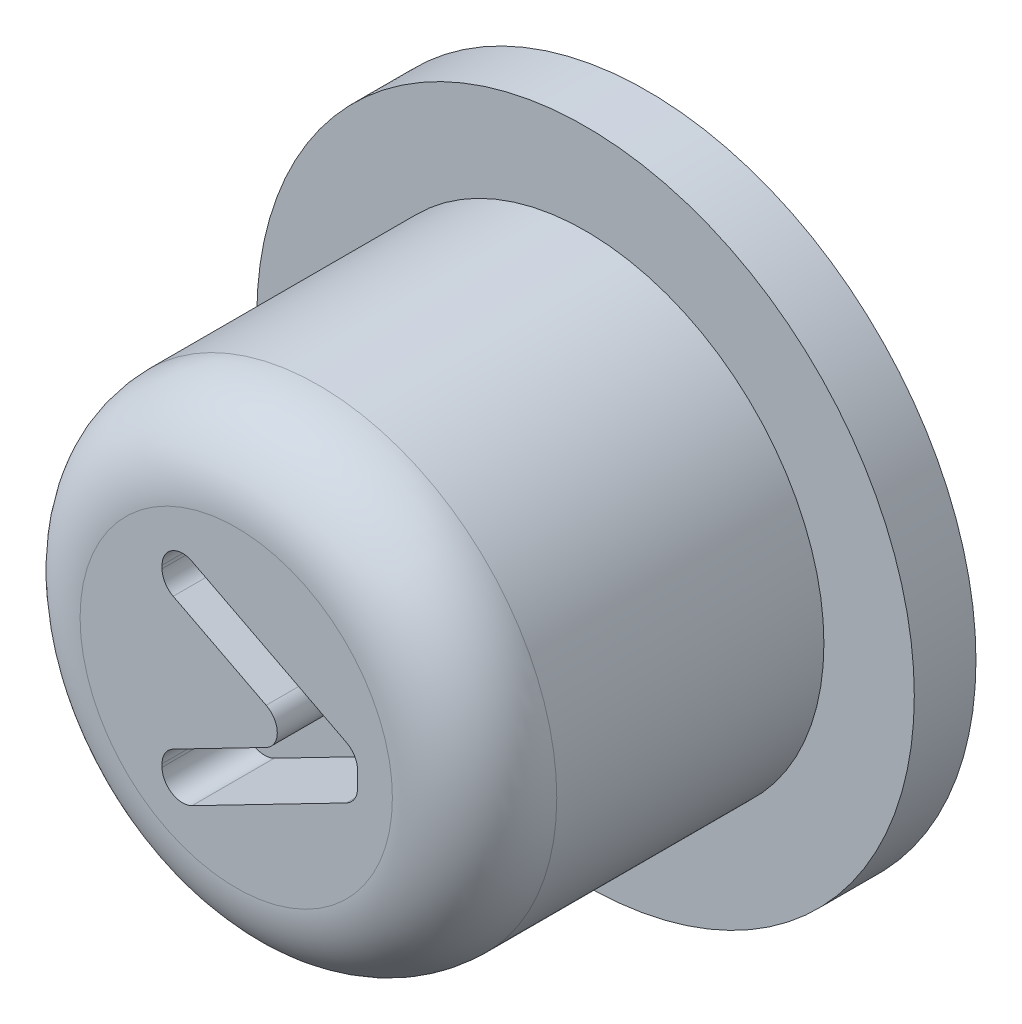
ISO-10303-21;
HEADER;
FILE_DESCRIPTION(('STEP AP214'),'2;1');
FILE_NAME('part.step','',(''),(''),'','','');
FILE_SCHEMA(('AUTOMOTIVE_DESIGN { 1 0 10303 214 1 1 1 1 }'));
ENDSEC;
DATA;
#1=APPLICATION_CONTEXT('core data for automotive mechanical design processes');
#2=APPLICATION_PROTOCOL_DEFINITION('international standard','automotive_design',2000,#1);
#3=PRODUCT_CONTEXT('',#1,'mechanical');
#4=PRODUCT('Part','Part','',(#3));
#5=PRODUCT_RELATED_PRODUCT_CATEGORY('part','',(#4));
#6=PRODUCT_DEFINITION_FORMATION('','',#4);
#7=PRODUCT_DEFINITION_CONTEXT('part definition',#1,'design');
#8=PRODUCT_DEFINITION('design','',#6,#7);
#9=PRODUCT_DEFINITION_SHAPE('','',#8);
#10=(LENGTH_UNIT() NAMED_UNIT(*) SI_UNIT(.MILLI.,.METRE.));
#11=(NAMED_UNIT(*) PLANE_ANGLE_UNIT() SI_UNIT($,.RADIAN.));
#12=(NAMED_UNIT(*) SI_UNIT($,.STERADIAN.) SOLID_ANGLE_UNIT());
#13=UNCERTAINTY_MEASURE_WITH_UNIT(LENGTH_MEASURE(1.E-05),#10,'distance_accuracy_value','');
#14=(GEOMETRIC_REPRESENTATION_CONTEXT(3) GLOBAL_UNCERTAINTY_ASSIGNED_CONTEXT((#13)) GLOBAL_UNIT_ASSIGNED_CONTEXT((#10,
#11,#12)) REPRESENTATION_CONTEXT('',''));
#15=CARTESIAN_POINT('',(0.,0.,0.));
#16=DIRECTION('',(0.,0.,1.));
#17=DIRECTION('',(1.,0.,0.));
#18=AXIS2_PLACEMENT_3D('',#15,#16,#17);
#19=CARTESIAN_POINT('',(0.,0.,5.));
#20=DIRECTION('',(0.,0.,1.));
#21=DIRECTION('',(1.,0.,0.));
#22=AXIS2_PLACEMENT_3D('',#19,#20,#21);
#23=PLANE('',#22);
#24=CARTESIAN_POINT('',(0.,0.,5.));
#25=DIRECTION('',(0.,0.,1.));
#26=DIRECTION('',(1.,0.,0.));
#27=AXIS2_PLACEMENT_3D('',#24,#25,#26);
#28=CIRCLE('',#27,1.9);
#29=CARTESIAN_POINT('',(1.9,0.,5.));
#30=VERTEX_POINT('',#29);
#31=EDGE_CURVE('E203',#30,#30,#28,.T.);
#32=ORIENTED_EDGE('',*,*,#31,.T.);
#33=EDGE_LOOP('',(#32));
#34=FACE_BOUND('',#33,.T.);
#35=DIRECTION('',(0.888852232674499,0.458193963807424,0.));
#36=VECTOR('',#35,1.);
#37=CARTESIAN_POINT('',(-0.902184431527705,-0.889722446353957,5.));
#38=LINE('',#37,#36);
#39=CARTESIAN_POINT('',(-0.766732922479561,-0.819898620128396,5.));
#40=VERTEX_POINT('',#39);
#41=CARTESIAN_POINT('',(0.364159467649987,-0.236935504522581,5.));
#42=VERTEX_POINT('',#41);
#43=EDGE_CURVE('E295',#40,#42,#38,.T.);
#44=ORIENTED_EDGE('',*,*,#43,.T.);
#45=CARTESIAN_POINT('',(0.249610976698131,-0.0147224463539568,5.));
#46=DIRECTION('',(0.,0.,1.));
#47=DIRECTION('',(1.,0.,0.));
#48=AXIS2_PLACEMENT_3D('',#45,#46,#47);
#49=CIRCLE('',#48,0.25);
#50=CARTESIAN_POINT('',(0.364159467649987,0.207490611814668,5.));
#51=VERTEX_POINT('',#50);
#52=EDGE_CURVE('E48',#42,#51,#49,.T.);
#53=ORIENTED_EDGE('',*,*,#52,.T.);
#54=DIRECTION('',(-0.888852232674499,0.458193963807424,0.));
#55=VECTOR('',#54,1.);
#56=CARTESIAN_POINT('',(0.79523143385691,-0.0147224463539568,5.));
#57=LINE('',#56,#55);
#58=CARTESIAN_POINT('',(-0.766732922479561,0.790453727420482,5.));
#59=VERTEX_POINT('',#58);
#60=EDGE_CURVE('E272',#51,#59,#57,.T.);
#61=ORIENTED_EDGE('',*,*,#60,.T.);
#62=CARTESIAN_POINT('',(-0.652184431527705,1.01266678558911,5.));
#63=DIRECTION('',(0.,0.,1.));
#64=DIRECTION('',(1.,0.,0.));
#65=AXIS2_PLACEMENT_3D('',#62,#63,#64);
#66=CIRCLE('',#65,0.25);
#67=CARTESIAN_POINT('',(-0.902184431527705,1.01266678558911,5.));
#68=VERTEX_POINT('',#67);
#69=EDGE_CURVE('E266',#59,#68,#66,.F.);
#70=ORIENTED_EDGE('',*,*,#69,.T.);
#71=DIRECTION('',(0.,1.,0.));
#72=VECTOR('',#71,1.);
#73=CARTESIAN_POINT('',(-0.902184431527705,0.860277553646043,5.));
#74=LINE('',#73,#72);
#75=CARTESIAN_POINT('',(-0.902184431527705,1.05025443462826,5.));
#76=VERTEX_POINT('',#75);
#77=EDGE_CURVE('E270',#68,#76,#74,.T.);
#78=ORIENTED_EDGE('',*,*,#77,.T.);
#79=CARTESIAN_POINT('',(-0.652184431527705,1.05025443462826,5.));
#80=DIRECTION('',(0.,0.,1.));
#81=DIRECTION('',(1.,0.,0.));
#82=AXIS2_PLACEMENT_3D('',#79,#80,#81);
#83=CIRCLE('',#82,0.25);
#84=CARTESIAN_POINT('',(-0.537612148228954,1.27245522648038,5.));
#85=VERTEX_POINT('',#84);
#86=EDGE_CURVE('E264',#76,#85,#83,.F.);
#87=ORIENTED_EDGE('',*,*,#86,.T.);
#88=DIRECTION('',(0.888803167408494,-0.458289133195005,0.));
#89=VECTOR('',#88,1.);
#90=CARTESIAN_POINT('',(-0.902184431527705,1.4604378100563,5.));
#91=LINE('',#90,#89);
#92=CARTESIAN_POINT('',(1.34059297997617,0.304005707249612,5.));
#93=VERTEX_POINT('',#92);
#94=EDGE_CURVE('E281',#85,#93,#91,.T.);
#95=ORIENTED_EDGE('',*,*,#94,.T.);
#96=CARTESIAN_POINT('',(1.22602069667742,0.0818049153974885,5.));
#97=DIRECTION('',(0.,0.,1.));
#98=DIRECTION('',(1.,0.,0.));
#99=AXIS2_PLACEMENT_3D('',#96,#97,#98);
#100=CIRCLE('',#99,0.25);
#101=CARTESIAN_POINT('',(1.47602069667742,0.0818049153974885,5.));
#102=VERTEX_POINT('',#101);
#103=EDGE_CURVE('E258',#93,#102,#100,.F.);
#104=ORIENTED_EDGE('',*,*,#103,.T.);
#105=DIRECTION('',(0.,-1.,0.));
#106=VECTOR('',#105,1.);
#107=CARTESIAN_POINT('',(1.47602069667742,0.234175790825531,5.));
#108=LINE('',#107,#106);
#109=CARTESIAN_POINT('',(1.47602069667742,-0.111209874852381,5.));
#110=VERTEX_POINT('',#109);
#111=EDGE_CURVE('E319',#102,#110,#108,.T.);
#112=ORIENTED_EDGE('',*,*,#111,.T.);
#113=CARTESIAN_POINT('',(1.22602069667742,-0.111209874852381,5.));
#114=DIRECTION('',(0.,0.,1.));
#115=DIRECTION('',(1.,0.,0.));
#116=AXIS2_PLACEMENT_3D('',#113,#114,#115);
#117=CIRCLE('',#116,0.25);
#118=CARTESIAN_POINT('',(1.34054122177573,-0.333437346896697,5.));
#119=VERTEX_POINT('',#118);
#120=EDGE_CURVE('E260',#110,#119,#117,.F.);
#121=ORIENTED_EDGE('',*,*,#120,.T.);
#122=DIRECTION('',(-0.888909888177266,-0.458082100393237,0.));
#123=VECTOR('',#122,1.);
#124=CARTESIAN_POINT('',(1.47602069667742,-0.263620683533444,5.));
#125=LINE('',#124,#123);
#126=CARTESIAN_POINT('',(-0.537663906429396,-1.30133314999297,5.));
#127=VERTEX_POINT('',#126);
#128=EDGE_CURVE('E322',#119,#127,#125,.T.);
#129=ORIENTED_EDGE('',*,*,#128,.T.);
#130=CARTESIAN_POINT('',(-0.652184431527705,-1.07910567794866,5.));
#131=DIRECTION('',(0.,0.,1.));
#132=DIRECTION('',(1.,0.,0.));
#133=AXIS2_PLACEMENT_3D('',#130,#131,#132);
#134=CIRCLE('',#133,0.25);
#135=CARTESIAN_POINT('',(-0.902184431527705,-1.07910567794866,5.));
#136=VERTEX_POINT('',#135);
#137=EDGE_CURVE('E262',#127,#136,#134,.F.);
#138=ORIENTED_EDGE('',*,*,#137,.T.);
#139=DIRECTION('',(0.,1.,0.));
#140=VECTOR('',#139,1.);
#141=CARTESIAN_POINT('',(-0.902184431527705,-1.48918158096934,5.));
#142=LINE('',#141,#140);
#143=CARTESIAN_POINT('',(-0.902184431527705,-1.04211167829702,5.));
#144=VERTEX_POINT('',#143);
#145=EDGE_CURVE('E299',#136,#144,#142,.T.);
#146=ORIENTED_EDGE('',*,*,#145,.T.);
#147=CARTESIAN_POINT('',(-0.652184431527705,-1.04211167829702,5.));
#148=DIRECTION('',(0.,0.,1.));
#149=DIRECTION('',(1.,0.,0.));
#150=AXIS2_PLACEMENT_3D('',#147,#148,#149);
#151=CIRCLE('',#150,0.25);
#152=EDGE_CURVE('E41',#144,#40,#151,.F.);
#153=ORIENTED_EDGE('',*,*,#152,.T.);
#154=EDGE_LOOP('',(#44,#53,#61,#70,#78,#87,#95,#104,#112,#121,#129,#138,#146,#153));
#155=FACE_BOUND('',#154,.T.);
#156=ADVANCED_FACE('F33',(#34,#155),#23,.T.);
#157=CARTESIAN_POINT('',(0.,0.,0.75));
#158=DIRECTION('',(0.,0.,-1.));
#159=DIRECTION('',(-1.,0.,0.));
#160=AXIS2_PLACEMENT_3D('',#157,#158,#159);
#161=CYLINDRICAL_SURFACE('',#160,4.);
#162=CARTESIAN_POINT('',(0.,0.,0.75));
#163=DIRECTION('',(0.,0.,1.));
#164=DIRECTION('',(1.,0.,0.));
#165=AXIS2_PLACEMENT_3D('',#162,#163,#164);
#166=CIRCLE('',#165,4.);
#167=CARTESIAN_POINT('',(4.,0.,0.75));
#168=VERTEX_POINT('',#167);
#169=EDGE_CURVE('E200',#168,#168,#166,.T.);
#170=ORIENTED_EDGE('',*,*,#169,.F.);
#171=EDGE_LOOP('',(#170));
#172=FACE_BOUND('',#171,.T.);
#173=CARTESIAN_POINT('',(0.,0.,0.));
#174=DIRECTION('',(0.,0.,1.));
#175=DIRECTION('',(1.,0.,0.));
#176=AXIS2_PLACEMENT_3D('',#173,#174,#175);
#177=CIRCLE('',#176,4.);
#178=CARTESIAN_POINT('',(4.,0.,0.));
#179=VERTEX_POINT('',#178);
#180=EDGE_CURVE('E199',#179,#179,#177,.T.);
#181=ORIENTED_EDGE('',*,*,#180,.T.);
#182=EDGE_LOOP('',(#181));
#183=FACE_BOUND('',#182,.T.);
#184=ADVANCED_FACE('F349',(#172,#183),#161,.T.);
#185=CARTESIAN_POINT('',(0.,0.,0.75));
#186=DIRECTION('',(0.,0.,1.));
#187=DIRECTION('',(1.,0.,0.));
#188=AXIS2_PLACEMENT_3D('',#185,#186,#187);
#189=PLANE('',#188);
#190=CARTESIAN_POINT('',(0.,0.,0.75));
#191=DIRECTION('',(0.,0.,1.));
#192=DIRECTION('',(1.,0.,0.));
#193=AXIS2_PLACEMENT_3D('',#190,#191,#192);
#194=CIRCLE('',#193,2.9);
#195=CARTESIAN_POINT('',(2.9,0.,0.75));
#196=VERTEX_POINT('',#195);
#197=EDGE_CURVE('E195',#196,#196,#194,.T.);
#198=ORIENTED_EDGE('',*,*,#197,.F.);
#199=EDGE_LOOP('',(#198));
#200=FACE_BOUND('',#199,.T.);
#201=ORIENTED_EDGE('',*,*,#169,.T.);
#202=EDGE_LOOP('',(#201));
#203=FACE_BOUND('',#202,.T.);
#204=ADVANCED_FACE('F354',(#200,#203),#189,.T.);
#205=CARTESIAN_POINT('',(0.,0.,0.));
#206=DIRECTION('',(0.,0.,1.));
#207=DIRECTION('',(1.,0.,0.));
#208=AXIS2_PLACEMENT_3D('',#205,#206,#207);
#209=PLANE('',#208);
#210=DIRECTION('',(1.,0.,0.));
#211=VECTOR('',#210,1.);
#212=CARTESIAN_POINT('',(-1.45,1.45,0.));
#213=LINE('',#212,#211);
#214=CARTESIAN_POINT('',(-1.45,1.45,0.));
#215=VERTEX_POINT('',#214);
#216=CARTESIAN_POINT('',(1.45,1.45,0.));
#217=VERTEX_POINT('',#216);
#218=EDGE_CURVE('E174',#215,#217,#213,.T.);
#219=ORIENTED_EDGE('',*,*,#218,.F.);
#220=DIRECTION('',(0.,1.,0.));
#221=VECTOR('',#220,1.);
#222=CARTESIAN_POINT('',(-1.45,-1.45,0.));
#223=LINE('',#222,#221);
#224=CARTESIAN_POINT('',(-1.45,-1.45,0.));
#225=VERTEX_POINT('',#224);
#226=EDGE_CURVE('E179',#225,#215,#223,.T.);
#227=ORIENTED_EDGE('',*,*,#226,.F.);
#228=DIRECTION('',(-1.,0.,0.));
#229=VECTOR('',#228,1.);
#230=CARTESIAN_POINT('',(1.45,-1.45,0.));
#231=LINE('',#230,#229);
#232=CARTESIAN_POINT('',(1.45,-1.45,0.));
#233=VERTEX_POINT('',#232);
#234=EDGE_CURVE('E184',#233,#225,#231,.T.);
#235=ORIENTED_EDGE('',*,*,#234,.F.);
#236=DIRECTION('',(0.,-1.,0.));
#237=VECTOR('',#236,1.);
#238=CARTESIAN_POINT('',(1.45,1.45,0.));
#239=LINE('',#238,#237);
#240=EDGE_CURVE('E163',#217,#233,#239,.T.);
#241=ORIENTED_EDGE('',*,*,#240,.F.);
#242=EDGE_LOOP('',(#219,#227,#235,#241));
#243=FACE_BOUND('',#242,.T.);
#244=ORIENTED_EDGE('',*,*,#180,.F.);
#245=EDGE_LOOP('',(#244));
#246=FACE_BOUND('',#245,.T.);
#247=ADVANCED_FACE('F181',(#243,#246),#209,.F.);
#248=CARTESIAN_POINT('',(0.,0.,5.));
#249=DIRECTION('',(0.,0.,-1.));
#250=DIRECTION('',(-1.,0.,0.));
#251=AXIS2_PLACEMENT_3D('',#248,#249,#250);
#252=CYLINDRICAL_SURFACE('',#251,2.9);
#253=CARTESIAN_POINT('',(0.,0.,4.));
#254=DIRECTION('',(0.,0.,1.));
#255=DIRECTION('',(1.,0.,0.));
#256=AXIS2_PLACEMENT_3D('',#253,#254,#255);
#257=CIRCLE('',#256,2.9);
#258=CARTESIAN_POINT('',(2.9,0.,4.));
#259=VERTEX_POINT('',#258);
#260=EDGE_CURVE('E208',#259,#259,#257,.F.);
#261=ORIENTED_EDGE('',*,*,#260,.T.);
#262=EDGE_LOOP('',(#261));
#263=FACE_BOUND('',#262,.T.);
#264=ORIENTED_EDGE('',*,*,#197,.T.);
#265=EDGE_LOOP('',(#264));
#266=FACE_BOUND('',#265,.T.);
#267=ADVANCED_FACE('F358',(#263,#266),#252,.T.);
#268=CARTESIAN_POINT('',(0.,0.,4.));
#269=DIRECTION('',(0.,0.,1.));
#270=DIRECTION('',(1.,0.,0.));
#271=AXIS2_PLACEMENT_3D('',#268,#269,#270);
#272=TOROIDAL_SURFACE('',#271,1.9,1.);
#273=ORIENTED_EDGE('',*,*,#260,.F.);
#274=EDGE_LOOP('',(#273));
#275=FACE_BOUND('',#274,.T.);
#276=ORIENTED_EDGE('',*,*,#31,.F.);
#277=EDGE_LOOP('',(#276));
#278=FACE_BOUND('',#277,.T.);
#279=ADVANCED_FACE('F361',(#275,#278),#272,.T.);
#280=CARTESIAN_POINT('',(-1.45,-1.45,5.10121933088198));
#281=DIRECTION('',(-1.,0.,0.));
#282=DIRECTION('',(0.,-1.,0.));
#283=AXIS2_PLACEMENT_3D('',#280,#281,#282);
#284=PLANE('',#283);
#285=DIRECTION('',(0.,-1.,0.));
#286=VECTOR('',#285,1.);
#287=CARTESIAN_POINT('',(-1.45,-1.45,1.));
#288=LINE('',#287,#286);
#289=CARTESIAN_POINT('',(-1.45,1.45,1.));
#290=VERTEX_POINT('',#289);
#291=CARTESIAN_POINT('',(-1.45,-1.45,1.));
#292=VERTEX_POINT('',#291);
#293=EDGE_CURVE('E196',#290,#292,#288,.T.);
#294=ORIENTED_EDGE('',*,*,#293,.T.);
#295=DIRECTION('',(0.,0.,-1.));
#296=VECTOR('',#295,1.);
#297=CARTESIAN_POINT('',(-1.45,-1.45,5.10121933088198));
#298=LINE('',#297,#296);
#299=EDGE_CURVE('E189',#292,#225,#298,.T.);
#300=ORIENTED_EDGE('',*,*,#299,.T.);
#301=ORIENTED_EDGE('',*,*,#226,.T.);
#302=DIRECTION('',(0.,0.,-1.));
#303=VECTOR('',#302,1.);
#304=CARTESIAN_POINT('',(-1.45,1.45,5.10121933088198));
#305=LINE('',#304,#303);
#306=EDGE_CURVE('E170',#290,#215,#305,.T.);
#307=ORIENTED_EDGE('',*,*,#306,.F.);
#308=EDGE_LOOP('',(#294,#300,#301,#307));
#309=FACE_BOUND('',#308,.T.);
#310=ADVANCED_FACE('F330',(#309),#284,.F.);
#311=CARTESIAN_POINT('',(1.45,-1.45,5.10121933088198));
#312=DIRECTION('',(0.,-1.,0.));
#313=DIRECTION('',(0.,0.,-1.));
#314=AXIS2_PLACEMENT_3D('',#311,#312,#313);
#315=PLANE('',#314);
#316=DIRECTION('',(1.,0.,0.));
#317=VECTOR('',#316,1.);
#318=CARTESIAN_POINT('',(1.45,-1.45,1.));
#319=LINE('',#318,#317);
#320=CARTESIAN_POINT('',(1.45,-1.45,1.));
#321=VERTEX_POINT('',#320);
#322=EDGE_CURVE('E327',#292,#321,#319,.T.);
#323=ORIENTED_EDGE('',*,*,#322,.T.);
#324=DIRECTION('',(0.,0.,-1.));
#325=VECTOR('',#324,1.);
#326=CARTESIAN_POINT('',(1.45,-1.45,5.10121933088198));
#327=LINE('',#326,#325);
#328=EDGE_CURVE('E169',#321,#233,#327,.T.);
#329=ORIENTED_EDGE('',*,*,#328,.T.);
#330=ORIENTED_EDGE('',*,*,#234,.T.);
#331=ORIENTED_EDGE('',*,*,#299,.F.);
#332=EDGE_LOOP('',(#323,#329,#330,#331));
#333=FACE_BOUND('',#332,.T.);
#334=ADVANCED_FACE('F335',(#333),#315,.F.);
#335=CARTESIAN_POINT('',(1.45,1.45,5.10121933088198));
#336=DIRECTION('',(1.,0.,0.));
#337=DIRECTION('',(0.,1.,0.));
#338=AXIS2_PLACEMENT_3D('',#335,#336,#337);
#339=PLANE('',#338);
#340=DIRECTION('',(0.,1.,0.));
#341=VECTOR('',#340,1.);
#342=CARTESIAN_POINT('',(1.45,1.45,1.));
#343=LINE('',#342,#341);
#344=CARTESIAN_POINT('',(1.45,1.45,1.));
#345=VERTEX_POINT('',#344);
#346=EDGE_CURVE('E166',#321,#345,#343,.T.);
#347=ORIENTED_EDGE('',*,*,#346,.T.);
#348=DIRECTION('',(0.,0.,-1.));
#349=VECTOR('',#348,1.);
#350=CARTESIAN_POINT('',(1.45,1.45,5.10121933088198));
#351=LINE('',#350,#349);
#352=EDGE_CURVE('E158',#345,#217,#351,.T.);
#353=ORIENTED_EDGE('',*,*,#352,.T.);
#354=ORIENTED_EDGE('',*,*,#240,.T.);
#355=ORIENTED_EDGE('',*,*,#328,.F.);
#356=EDGE_LOOP('',(#347,#353,#354,#355));
#357=FACE_BOUND('',#356,.T.);
#358=ADVANCED_FACE('F160',(#357),#339,.F.);
#359=CARTESIAN_POINT('',(-1.45,1.45,5.10121933088198));
#360=DIRECTION('',(0.,1.,0.));
#361=DIRECTION('',(0.,0.,1.));
#362=AXIS2_PLACEMENT_3D('',#359,#360,#361);
#363=PLANE('',#362);
#364=DIRECTION('',(-1.,0.,0.));
#365=VECTOR('',#364,1.);
#366=CARTESIAN_POINT('',(-1.45,1.45,1.));
#367=LINE('',#366,#365);
#368=EDGE_CURVE('E193',#345,#290,#367,.T.);
#369=ORIENTED_EDGE('',*,*,#368,.T.);
#370=ORIENTED_EDGE('',*,*,#306,.T.);
#371=ORIENTED_EDGE('',*,*,#218,.T.);
#372=ORIENTED_EDGE('',*,*,#352,.F.);
#373=EDGE_LOOP('',(#369,#370,#371,#372));
#374=FACE_BOUND('',#373,.T.);
#375=ADVANCED_FACE('F175',(#374),#363,.F.);
#376=CARTESIAN_POINT('',(0.,0.,1.));
#377=DIRECTION('',(0.,0.,-1.));
#378=DIRECTION('',(-1.,0.,0.));
#379=AXIS2_PLACEMENT_3D('',#376,#377,#378);
#380=PLANE('',#379);
#381=ORIENTED_EDGE('',*,*,#293,.F.);
#382=ORIENTED_EDGE('',*,*,#368,.F.);
#383=ORIENTED_EDGE('',*,*,#346,.F.);
#384=ORIENTED_EDGE('',*,*,#322,.F.);
#385=EDGE_LOOP('',(#381,#382,#383,#384));
#386=FACE_BOUND('',#385,.T.);
#387=ADVANCED_FACE('F337',(#386),#380,.T.);
#388=CARTESIAN_POINT('',(0.79523143385691,-0.0147224463539568,4.));
#389=DIRECTION('',(0.458193963807424,0.888852232674499,0.));
#390=DIRECTION('',(-0.888852232674499,0.458193963807424,0.));
#391=AXIS2_PLACEMENT_3D('',#388,#389,#390);
#392=PLANE('',#391);
#393=DIRECTION('',(-0.888852232674499,0.458193963807424,0.));
#394=VECTOR('',#393,1.);
#395=CARTESIAN_POINT('',(0.79523143385691,-0.0147224463539568,4.));
#396=LINE('',#395,#394);
#397=CARTESIAN_POINT('',(0.364159467649987,0.207490611814668,4.));
#398=VERTEX_POINT('',#397);
#399=CARTESIAN_POINT('',(-0.766732922479561,0.790453727420482,4.));
#400=VERTEX_POINT('',#399);
#401=EDGE_CURVE('E290',#398,#400,#396,.T.);
#402=ORIENTED_EDGE('',*,*,#401,.T.);
#403=DIRECTION('',(0.,0.,1.));
#404=VECTOR('',#403,1.);
#405=CARTESIAN_POINT('',(-0.766732922479561,0.790453727420482,5.));
#406=LINE('',#405,#404);
#407=EDGE_CURVE('E250',#400,#59,#406,.T.);
#408=ORIENTED_EDGE('',*,*,#407,.T.);
#409=ORIENTED_EDGE('',*,*,#60,.F.);
#410=DIRECTION('',(0.,0.,1.));
#411=VECTOR('',#410,1.);
#412=CARTESIAN_POINT('',(0.364159467649987,0.207490611814668,4.));
#413=LINE('',#412,#411);
#414=EDGE_CURVE('E248',#51,#398,#413,.F.);
#415=ORIENTED_EDGE('',*,*,#414,.T.);
#416=EDGE_LOOP('',(#402,#408,#409,#415));
#417=FACE_BOUND('',#416,.T.);
#418=ADVANCED_FACE('F294',(#417),#392,.T.);
#419=CARTESIAN_POINT('',(-0.902184431527705,0.860277553646043,4.));
#420=DIRECTION('',(1.,0.,0.));
#421=DIRECTION('',(0.,0.,-1.));
#422=AXIS2_PLACEMENT_3D('',#419,#420,#421);
#423=PLANE('',#422);
#424=DIRECTION('',(0.,1.,0.));
#425=VECTOR('',#424,1.);
#426=CARTESIAN_POINT('',(-0.902184431527705,0.860277553646043,4.));
#427=LINE('',#426,#425);
#428=CARTESIAN_POINT('',(-0.902184431527705,1.01266678558911,4.));
#429=VERTEX_POINT('',#428);
#430=CARTESIAN_POINT('',(-0.902184431527705,1.05025443462826,4.));
#431=VERTEX_POINT('',#430);
#432=EDGE_CURVE('E292',#429,#431,#427,.T.);
#433=ORIENTED_EDGE('',*,*,#432,.T.);
#434=DIRECTION('',(0.,0.,1.));
#435=VECTOR('',#434,1.);
#436=CARTESIAN_POINT('',(-0.902184431527705,1.05025443462826,5.));
#437=LINE('',#436,#435);
#438=EDGE_CURVE('E245',#431,#76,#437,.T.);
#439=ORIENTED_EDGE('',*,*,#438,.T.);
#440=ORIENTED_EDGE('',*,*,#77,.F.);
#441=DIRECTION('',(0.,0.,1.));
#442=VECTOR('',#441,1.);
#443=CARTESIAN_POINT('',(-0.902184431527705,1.01266678558911,4.));
#444=LINE('',#443,#442);
#445=EDGE_CURVE('E243',#68,#429,#444,.F.);
#446=ORIENTED_EDGE('',*,*,#445,.T.);
#447=EDGE_LOOP('',(#433,#439,#440,#446));
#448=FACE_BOUND('',#447,.T.);
#449=ADVANCED_FACE('F278',(#448),#423,.T.);
#450=CARTESIAN_POINT('',(-0.902184431527705,1.4604378100563,4.));
#451=DIRECTION('',(-0.458289133195005,-0.888803167408494,0.));
#452=DIRECTION('',(0.888803167408494,-0.458289133195005,0.));
#453=AXIS2_PLACEMENT_3D('',#450,#451,#452);
#454=PLANE('',#453);
#455=DIRECTION('',(0.888803167408494,-0.458289133195005,0.));
#456=VECTOR('',#455,1.);
#457=CARTESIAN_POINT('',(-0.902184431527705,1.4604378100563,4.));
#458=LINE('',#457,#456);
#459=CARTESIAN_POINT('',(-0.537612148228954,1.27245522648038,4.));
#460=VERTEX_POINT('',#459);
#461=CARTESIAN_POINT('',(1.34059297997617,0.304005707249612,4.));
#462=VERTEX_POINT('',#461);
#463=EDGE_CURVE('E297',#460,#462,#458,.T.);
#464=ORIENTED_EDGE('',*,*,#463,.T.);
#465=DIRECTION('',(0.,0.,1.));
#466=VECTOR('',#465,1.);
#467=CARTESIAN_POINT('',(1.34059297997617,0.304005707249612,5.));
#468=LINE('',#467,#466);
#469=EDGE_CURVE('E213',#462,#93,#468,.T.);
#470=ORIENTED_EDGE('',*,*,#469,.T.);
#471=ORIENTED_EDGE('',*,*,#94,.F.);
#472=DIRECTION('',(0.,0.,1.));
#473=VECTOR('',#472,1.);
#474=CARTESIAN_POINT('',(-0.537612148228954,1.27245522648038,4.));
#475=LINE('',#474,#473);
#476=EDGE_CURVE('E211',#85,#460,#475,.F.);
#477=ORIENTED_EDGE('',*,*,#476,.T.);
#478=EDGE_LOOP('',(#464,#470,#471,#477));
#479=FACE_BOUND('',#478,.T.);
#480=ADVANCED_FACE('F421',(#479),#454,.T.);
#481=CARTESIAN_POINT('',(1.47602069667742,0.234175790825531,4.));
#482=DIRECTION('',(-1.,0.,0.));
#483=DIRECTION('',(0.,0.,1.));
#484=AXIS2_PLACEMENT_3D('',#481,#482,#483);
#485=PLANE('',#484);
#486=ORIENTED_EDGE('',*,*,#111,.F.);
#487=DIRECTION('',(0.,0.,1.));
#488=VECTOR('',#487,1.);
#489=CARTESIAN_POINT('',(1.47602069667742,0.0818049153974885,4.));
#490=LINE('',#489,#488);
#491=CARTESIAN_POINT('',(1.47602069667742,0.0818049153974885,4.));
#492=VERTEX_POINT('',#491);
#493=EDGE_CURVE('E219',#102,#492,#490,.F.);
#494=ORIENTED_EDGE('',*,*,#493,.T.);
#495=DIRECTION('',(0.,-1.,0.));
#496=VECTOR('',#495,1.);
#497=CARTESIAN_POINT('',(1.47602069667742,0.234175790825531,4.));
#498=LINE('',#497,#496);
#499=CARTESIAN_POINT('',(1.47602069667742,-0.111209874852381,4.));
#500=VERTEX_POINT('',#499);
#501=EDGE_CURVE('E304',#492,#500,#498,.T.);
#502=ORIENTED_EDGE('',*,*,#501,.T.);
#503=DIRECTION('',(0.,0.,1.));
#504=VECTOR('',#503,1.);
#505=CARTESIAN_POINT('',(1.47602069667742,-0.111209874852381,5.));
#506=LINE('',#505,#504);
#507=EDGE_CURVE('E216',#500,#110,#506,.T.);
#508=ORIENTED_EDGE('',*,*,#507,.T.);
#509=EDGE_LOOP('',(#486,#494,#502,#508));
#510=FACE_BOUND('',#509,.T.);
#511=ADVANCED_FACE('F415',(#510),#485,.T.);
#512=CARTESIAN_POINT('',(1.47602069667742,-0.263620683533444,4.));
#513=DIRECTION('',(-0.458082100393237,0.888909888177266,0.));
#514=DIRECTION('',(-0.888909888177266,-0.458082100393237,0.));
#515=AXIS2_PLACEMENT_3D('',#512,#513,#514);
#516=PLANE('',#515);
#517=ORIENTED_EDGE('',*,*,#128,.F.);
#518=DIRECTION('',(0.,0.,1.));
#519=VECTOR('',#518,1.);
#520=CARTESIAN_POINT('',(1.34054122177573,-0.333437346896697,4.));
#521=LINE('',#520,#519);
#522=CARTESIAN_POINT('',(1.34054122177573,-0.333437346896697,4.));
#523=VERTEX_POINT('',#522);
#524=EDGE_CURVE('E236',#119,#523,#521,.F.);
#525=ORIENTED_EDGE('',*,*,#524,.T.);
#526=DIRECTION('',(-0.888909888177266,-0.458082100393237,0.));
#527=VECTOR('',#526,1.);
#528=CARTESIAN_POINT('',(1.47602069667742,-0.263620683533444,4.));
#529=LINE('',#528,#527);
#530=CARTESIAN_POINT('',(-0.537663906429396,-1.30133314999297,4.));
#531=VERTEX_POINT('',#530);
#532=EDGE_CURVE('E307',#523,#531,#529,.T.);
#533=ORIENTED_EDGE('',*,*,#532,.T.);
#534=DIRECTION('',(0.,0.,1.));
#535=VECTOR('',#534,1.);
#536=CARTESIAN_POINT('',(-0.537663906429396,-1.30133314999297,5.));
#537=LINE('',#536,#535);
#538=EDGE_CURVE('E233',#531,#127,#537,.T.);
#539=ORIENTED_EDGE('',*,*,#538,.T.);
#540=EDGE_LOOP('',(#517,#525,#533,#539));
#541=FACE_BOUND('',#540,.T.);
#542=ADVANCED_FACE('F409',(#541),#516,.T.);
#543=CARTESIAN_POINT('',(-0.902184431527705,-1.48918158096934,4.));
#544=DIRECTION('',(1.,0.,0.));
#545=DIRECTION('',(0.,0.,-1.));
#546=AXIS2_PLACEMENT_3D('',#543,#544,#545);
#547=PLANE('',#546);
#548=ORIENTED_EDGE('',*,*,#145,.F.);
#549=DIRECTION('',(0.,0.,1.));
#550=VECTOR('',#549,1.);
#551=CARTESIAN_POINT('',(-0.902184431527705,-1.07910567794866,4.));
#552=LINE('',#551,#550);
#553=CARTESIAN_POINT('',(-0.902184431527705,-1.07910567794866,4.));
#554=VERTEX_POINT('',#553);
#555=EDGE_CURVE('E241',#136,#554,#552,.F.);
#556=ORIENTED_EDGE('',*,*,#555,.T.);
#557=DIRECTION('',(0.,1.,0.));
#558=VECTOR('',#557,1.);
#559=CARTESIAN_POINT('',(-0.902184431527705,-1.48918158096934,4.));
#560=LINE('',#559,#558);
#561=CARTESIAN_POINT('',(-0.902184431527705,-1.04211167829702,4.));
#562=VERTEX_POINT('',#561);
#563=EDGE_CURVE('E310',#554,#562,#560,.T.);
#564=ORIENTED_EDGE('',*,*,#563,.T.);
#565=DIRECTION('',(0.,0.,1.));
#566=VECTOR('',#565,1.);
#567=CARTESIAN_POINT('',(-0.902184431527705,-1.04211167829702,5.));
#568=LINE('',#567,#566);
#569=EDGE_CURVE('E238',#562,#144,#568,.T.);
#570=ORIENTED_EDGE('',*,*,#569,.T.);
#571=EDGE_LOOP('',(#548,#556,#564,#570));
#572=FACE_BOUND('',#571,.T.);
#573=ADVANCED_FACE('F402',(#572),#547,.T.);
#574=CARTESIAN_POINT('',(-0.902184431527705,-0.889722446353957,4.));
#575=DIRECTION('',(0.458193963807424,-0.888852232674499,0.));
#576=DIRECTION('',(0.888852232674499,0.458193963807424,0.));
#577=AXIS2_PLACEMENT_3D('',#574,#575,#576);
#578=PLANE('',#577);
#579=ORIENTED_EDGE('',*,*,#43,.F.);
#580=DIRECTION('',(0.,0.,1.));
#581=VECTOR('',#580,1.);
#582=CARTESIAN_POINT('',(-0.766732922479561,-0.819898620128396,4.));
#583=LINE('',#582,#581);
#584=CARTESIAN_POINT('',(-0.766732922479561,-0.819898620128396,4.));
#585=VERTEX_POINT('',#584);
#586=EDGE_CURVE('E255',#40,#585,#583,.F.);
#587=ORIENTED_EDGE('',*,*,#586,.T.);
#588=DIRECTION('',(0.888852232674499,0.458193963807424,0.));
#589=VECTOR('',#588,1.);
#590=CARTESIAN_POINT('',(-0.902184431527705,-0.889722446353957,4.));
#591=LINE('',#590,#589);
#592=CARTESIAN_POINT('',(0.364159467649987,-0.236935504522581,4.));
#593=VERTEX_POINT('',#592);
#594=EDGE_CURVE('E313',#585,#593,#591,.T.);
#595=ORIENTED_EDGE('',*,*,#594,.T.);
#596=DIRECTION('',(0.,0.,1.));
#597=VECTOR('',#596,1.);
#598=CARTESIAN_POINT('',(0.364159467649987,-0.236935504522581,4.));
#599=LINE('',#598,#597);
#600=EDGE_CURVE('E253',#593,#42,#599,.T.);
#601=ORIENTED_EDGE('',*,*,#600,.T.);
#602=EDGE_LOOP('',(#579,#587,#595,#601));
#603=FACE_BOUND('',#602,.T.);
#604=ADVANCED_FACE('F502',(#603),#578,.T.);
#605=CARTESIAN_POINT('',(0.,0.,4.));
#606=DIRECTION('',(0.,0.,-1.));
#607=DIRECTION('',(-1.,0.,0.));
#608=AXIS2_PLACEMENT_3D('',#605,#606,#607);
#609=PLANE('',#608);
#610=ORIENTED_EDGE('',*,*,#501,.F.);
#611=CARTESIAN_POINT('',(1.22602069667742,0.0818049153974885,4.));
#612=DIRECTION('',(0.,0.,-1.));
#613=DIRECTION('',(-1.,0.,0.));
#614=AXIS2_PLACEMENT_3D('',#611,#612,#613);
#615=CIRCLE('',#614,0.25);
#616=EDGE_CURVE('E231',#492,#462,#615,.F.);
#617=ORIENTED_EDGE('',*,*,#616,.T.);
#618=ORIENTED_EDGE('',*,*,#463,.F.);
#619=CARTESIAN_POINT('',(-0.652184431527705,1.05025443462826,4.));
#620=DIRECTION('',(0.,0.,-1.));
#621=DIRECTION('',(-1.,0.,0.));
#622=AXIS2_PLACEMENT_3D('',#619,#620,#621);
#623=CIRCLE('',#622,0.25);
#624=EDGE_CURVE('E225',#460,#431,#623,.F.);
#625=ORIENTED_EDGE('',*,*,#624,.T.);
#626=ORIENTED_EDGE('',*,*,#432,.F.);
#627=CARTESIAN_POINT('',(-0.652184431527705,1.01266678558911,4.));
#628=DIRECTION('',(0.,0.,-1.));
#629=DIRECTION('',(-1.,0.,0.));
#630=AXIS2_PLACEMENT_3D('',#627,#628,#629);
#631=CIRCLE('',#630,0.25);
#632=EDGE_CURVE('E223',#429,#400,#631,.F.);
#633=ORIENTED_EDGE('',*,*,#632,.T.);
#634=ORIENTED_EDGE('',*,*,#401,.F.);
#635=CARTESIAN_POINT('',(0.249610976698131,-0.0147224463539568,4.));
#636=DIRECTION('',(0.,0.,-1.));
#637=DIRECTION('',(-1.,0.,0.));
#638=AXIS2_PLACEMENT_3D('',#635,#636,#637);
#639=CIRCLE('',#638,0.25);
#640=EDGE_CURVE('E11',#398,#593,#639,.T.);
#641=ORIENTED_EDGE('',*,*,#640,.T.);
#642=ORIENTED_EDGE('',*,*,#594,.F.);
#643=CARTESIAN_POINT('',(-0.652184431527705,-1.04211167829702,4.));
#644=DIRECTION('',(0.,0.,-1.));
#645=DIRECTION('',(-1.,0.,0.));
#646=AXIS2_PLACEMENT_3D('',#643,#644,#645);
#647=CIRCLE('',#646,0.25);
#648=EDGE_CURVE('E221',#585,#562,#647,.F.);
#649=ORIENTED_EDGE('',*,*,#648,.T.);
#650=ORIENTED_EDGE('',*,*,#563,.F.);
#651=CARTESIAN_POINT('',(-0.652184431527705,-1.07910567794866,4.));
#652=DIRECTION('',(0.,0.,-1.));
#653=DIRECTION('',(-1.,0.,0.));
#654=AXIS2_PLACEMENT_3D('',#651,#652,#653);
#655=CIRCLE('',#654,0.25);
#656=EDGE_CURVE('E227',#554,#531,#655,.F.);
#657=ORIENTED_EDGE('',*,*,#656,.T.);
#658=ORIENTED_EDGE('',*,*,#532,.F.);
#659=CARTESIAN_POINT('',(1.22602069667742,-0.111209874852381,4.));
#660=DIRECTION('',(0.,0.,-1.));
#661=DIRECTION('',(-1.,0.,0.));
#662=AXIS2_PLACEMENT_3D('',#659,#660,#661);
#663=CIRCLE('',#662,0.25);
#664=EDGE_CURVE('E229',#523,#500,#663,.F.);
#665=ORIENTED_EDGE('',*,*,#664,.T.);
#666=EDGE_LOOP('',(#610,#617,#618,#625,#626,#633,#634,#641,#642,#649,#650,#657,#658,#665));
#667=FACE_BOUND('',#666,.T.);
#668=ADVANCED_FACE('F289',(#667),#609,.F.);
#669=CARTESIAN_POINT('',(1.22602069667742,0.0818049153974885,4.));
#670=DIRECTION('',(0.,0.,-1.));
#671=DIRECTION('',(-1.,0.,0.));
#672=AXIS2_PLACEMENT_3D('',#669,#670,#671);
#673=CYLINDRICAL_SURFACE('',#672,0.25);
#674=ORIENTED_EDGE('',*,*,#616,.F.);
#675=ORIENTED_EDGE('',*,*,#493,.F.);
#676=ORIENTED_EDGE('',*,*,#103,.F.);
#677=ORIENTED_EDGE('',*,*,#469,.F.);
#678=EDGE_LOOP('',(#674,#675,#676,#677));
#679=FACE_BOUND('',#678,.T.);
#680=ADVANCED_FACE('F371',(#679),#673,.F.);
#681=CARTESIAN_POINT('',(1.22602069667742,-0.111209874852381,4.));
#682=DIRECTION('',(0.,0.,-1.));
#683=DIRECTION('',(-1.,0.,0.));
#684=AXIS2_PLACEMENT_3D('',#681,#682,#683);
#685=CYLINDRICAL_SURFACE('',#684,0.25);
#686=ORIENTED_EDGE('',*,*,#664,.F.);
#687=ORIENTED_EDGE('',*,*,#524,.F.);
#688=ORIENTED_EDGE('',*,*,#120,.F.);
#689=ORIENTED_EDGE('',*,*,#507,.F.);
#690=EDGE_LOOP('',(#686,#687,#688,#689));
#691=FACE_BOUND('',#690,.T.);
#692=ADVANCED_FACE('F374',(#691),#685,.F.);
#693=CARTESIAN_POINT('',(-0.652184431527705,-1.07910567794866,4.));
#694=DIRECTION('',(0.,0.,-1.));
#695=DIRECTION('',(-1.,0.,0.));
#696=AXIS2_PLACEMENT_3D('',#693,#694,#695);
#697=CYLINDRICAL_SURFACE('',#696,0.25);
#698=ORIENTED_EDGE('',*,*,#656,.F.);
#699=ORIENTED_EDGE('',*,*,#555,.F.);
#700=ORIENTED_EDGE('',*,*,#137,.F.);
#701=ORIENTED_EDGE('',*,*,#538,.F.);
#702=EDGE_LOOP('',(#698,#699,#700,#701));
#703=FACE_BOUND('',#702,.T.);
#704=ADVANCED_FACE('F378',(#703),#697,.F.);
#705=CARTESIAN_POINT('',(-0.652184431527705,1.05025443462826,4.));
#706=DIRECTION('',(0.,0.,-1.));
#707=DIRECTION('',(-1.,0.,0.));
#708=AXIS2_PLACEMENT_3D('',#705,#706,#707);
#709=CYLINDRICAL_SURFACE('',#708,0.25);
#710=ORIENTED_EDGE('',*,*,#624,.F.);
#711=ORIENTED_EDGE('',*,*,#476,.F.);
#712=ORIENTED_EDGE('',*,*,#86,.F.);
#713=ORIENTED_EDGE('',*,*,#438,.F.);
#714=EDGE_LOOP('',(#710,#711,#712,#713));
#715=FACE_BOUND('',#714,.T.);
#716=ADVANCED_FACE('F382',(#715),#709,.F.);
#717=CARTESIAN_POINT('',(-0.652184431527705,1.01266678558911,4.));
#718=DIRECTION('',(0.,0.,-1.));
#719=DIRECTION('',(-1.,0.,0.));
#720=AXIS2_PLACEMENT_3D('',#717,#718,#719);
#721=CYLINDRICAL_SURFACE('',#720,0.25);
#722=ORIENTED_EDGE('',*,*,#632,.F.);
#723=ORIENTED_EDGE('',*,*,#445,.F.);
#724=ORIENTED_EDGE('',*,*,#69,.F.);
#725=ORIENTED_EDGE('',*,*,#407,.F.);
#726=EDGE_LOOP('',(#722,#723,#724,#725));
#727=FACE_BOUND('',#726,.T.);
#728=ADVANCED_FACE('F284',(#727),#721,.F.);
#729=CARTESIAN_POINT('',(-0.652184431527705,-1.04211167829702,4.));
#730=DIRECTION('',(0.,0.,-1.));
#731=DIRECTION('',(-1.,0.,0.));
#732=AXIS2_PLACEMENT_3D('',#729,#730,#731);
#733=CYLINDRICAL_SURFACE('',#732,0.25);
#734=ORIENTED_EDGE('',*,*,#648,.F.);
#735=ORIENTED_EDGE('',*,*,#586,.F.);
#736=ORIENTED_EDGE('',*,*,#152,.F.);
#737=ORIENTED_EDGE('',*,*,#569,.F.);
#738=EDGE_LOOP('',(#734,#735,#736,#737));
#739=FACE_BOUND('',#738,.T.);
#740=ADVANCED_FACE('F388',(#739),#733,.F.);
#741=CARTESIAN_POINT('',(0.249610976698131,-0.0147224463539568,4.));
#742=DIRECTION('',(0.,0.,1.));
#743=DIRECTION('',(1.,0.,0.));
#744=AXIS2_PLACEMENT_3D('',#741,#742,#743);
#745=CYLINDRICAL_SURFACE('',#744,0.25);
#746=ORIENTED_EDGE('',*,*,#640,.F.);
#747=ORIENTED_EDGE('',*,*,#414,.F.);
#748=ORIENTED_EDGE('',*,*,#52,.F.);
#749=ORIENTED_EDGE('',*,*,#600,.F.);
#750=EDGE_LOOP('',(#746,#747,#748,#749));
#751=FACE_BOUND('',#750,.T.);
#752=ADVANCED_FACE('F35',(#751),#745,.T.);
#753=CLOSED_SHELL('',(#156,#184,#204,#247,#267,#279,#310,#334,#358,#375,#387,#418,#449,#480,
#511,#542,#573,#604,#668,#680,#692,#704,#716,#728,#740,#752));
#754=MANIFOLD_SOLID_BREP('B2',#753);
#755=ADVANCED_BREP_SHAPE_REPRESENTATION('',(#18,#754),#14);
#756=SHAPE_DEFINITION_REPRESENTATION(#9,#755);
ENDSEC;
END-ISO-10303-21;
